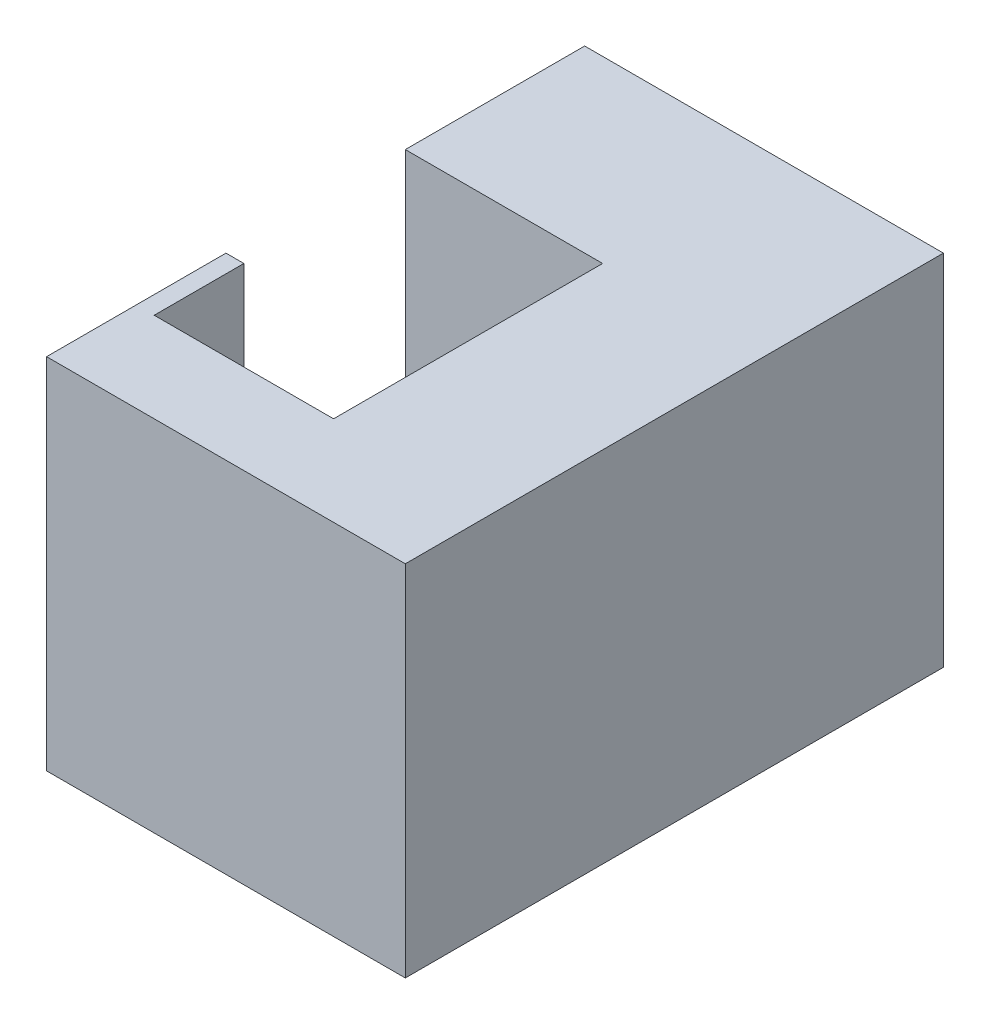
ISO-10303-21;
HEADER;
FILE_DESCRIPTION(('STEP AP214'),'2;1');
FILE_NAME('part.step','',(''),(''),'','','');
FILE_SCHEMA(('AUTOMOTIVE_DESIGN { 1 0 10303 214 1 1 1 1 }'));
ENDSEC;
DATA;
#1=APPLICATION_CONTEXT('core data for automotive mechanical design processes');
#2=APPLICATION_PROTOCOL_DEFINITION('international standard','automotive_design',2000,#1);
#3=PRODUCT_CONTEXT('',#1,'mechanical');
#4=PRODUCT('Part','Part','',(#3));
#5=PRODUCT_RELATED_PRODUCT_CATEGORY('part','',(#4));
#6=PRODUCT_DEFINITION_FORMATION('','',#4);
#7=PRODUCT_DEFINITION_CONTEXT('part definition',#1,'design');
#8=PRODUCT_DEFINITION('design','',#6,#7);
#9=PRODUCT_DEFINITION_SHAPE('','',#8);
#10=(LENGTH_UNIT() NAMED_UNIT(*) SI_UNIT(.MILLI.,.METRE.));
#11=(NAMED_UNIT(*) PLANE_ANGLE_UNIT() SI_UNIT($,.RADIAN.));
#12=(NAMED_UNIT(*) SI_UNIT($,.STERADIAN.) SOLID_ANGLE_UNIT());
#13=UNCERTAINTY_MEASURE_WITH_UNIT(LENGTH_MEASURE(1.E-05),#10,'distance_accuracy_value','');
#14=(GEOMETRIC_REPRESENTATION_CONTEXT(3) GLOBAL_UNCERTAINTY_ASSIGNED_CONTEXT((#13)) GLOBAL_UNIT_ASSIGNED_CONTEXT((#10,
#11,#12)) REPRESENTATION_CONTEXT('',''));
#15=CARTESIAN_POINT('',(0.,0.,0.));
#16=DIRECTION('',(0.,0.,1.));
#17=DIRECTION('',(1.,0.,0.));
#18=AXIS2_PLACEMENT_3D('',#15,#16,#17);
#19=CARTESIAN_POINT('',(-2.5,5.,3.75));
#20=DIRECTION('',(1.,0.,0.));
#21=DIRECTION('',(0.,0.,-1.));
#22=AXIS2_PLACEMENT_3D('',#19,#20,#21);
#23=PLANE('',#22);
#24=DIRECTION('',(0.,1.,0.));
#25=VECTOR('',#24,1.);
#26=CARTESIAN_POINT('',(-2.5,-12.8847050800552,1.25));
#27=LINE('',#26,#25);
#28=CARTESIAN_POINT('',(-2.5,0.,1.25));
#29=VERTEX_POINT('',#28);
#30=CARTESIAN_POINT('',(-2.5,5.,1.25));
#31=VERTEX_POINT('',#30);
#32=EDGE_CURVE('E171',#29,#31,#27,.T.);
#33=ORIENTED_EDGE('',*,*,#32,.F.);
#34=DIRECTION('',(0.,0.,1.));
#35=VECTOR('',#34,1.);
#36=CARTESIAN_POINT('',(-2.5,0.,3.75));
#37=LINE('',#36,#35);
#38=CARTESIAN_POINT('',(-2.5,0.,3.75));
#39=VERTEX_POINT('',#38);
#40=EDGE_CURVE('E200',#29,#39,#37,.T.);
#41=ORIENTED_EDGE('',*,*,#40,.T.);
#42=DIRECTION('',(0.,-1.,0.));
#43=VECTOR('',#42,1.);
#44=CARTESIAN_POINT('',(-2.5,5.,3.75));
#45=LINE('',#44,#43);
#46=CARTESIAN_POINT('',(-2.5,5.,3.75));
#47=VERTEX_POINT('',#46);
#48=EDGE_CURVE('E209',#47,#39,#45,.T.);
#49=ORIENTED_EDGE('',*,*,#48,.F.);
#50=DIRECTION('',(0.,0.,1.));
#51=VECTOR('',#50,1.);
#52=CARTESIAN_POINT('',(-2.5,5.,3.75));
#53=LINE('',#52,#51);
#54=EDGE_CURVE('E187',#31,#47,#53,.T.);
#55=ORIENTED_EDGE('',*,*,#54,.F.);
#56=EDGE_LOOP('',(#33,#41,#49,#55));
#57=FACE_BOUND('',#56,.T.);
#58=ADVANCED_FACE('F39',(#57),#23,.F.);
#59=DIRECTION('',(0.,1.,0.));
#60=VECTOR('',#59,1.);
#61=CARTESIAN_POINT('',(-2.5,-12.8847050800552,-1.25));
#62=LINE('',#61,#60);
#63=CARTESIAN_POINT('',(-2.5,0.,-1.25));
#64=VERTEX_POINT('',#63);
#65=CARTESIAN_POINT('',(-2.5,5.,-1.25));
#66=VERTEX_POINT('',#65);
#67=EDGE_CURVE('E55',#64,#66,#62,.T.);
#68=ORIENTED_EDGE('',*,*,#67,.T.);
#69=CARTESIAN_POINT('',(-2.5,5.,-3.75));
#70=VERTEX_POINT('',#69);
#71=EDGE_CURVE('E147',#70,#66,#53,.T.);
#72=ORIENTED_EDGE('',*,*,#71,.F.);
#73=DIRECTION('',(0.,-1.,0.));
#74=VECTOR('',#73,1.);
#75=CARTESIAN_POINT('',(-2.5,5.,-3.75));
#76=LINE('',#75,#74);
#77=CARTESIAN_POINT('',(-2.5,0.,-3.75));
#78=VERTEX_POINT('',#77);
#79=EDGE_CURVE('E48',#70,#78,#76,.T.);
#80=ORIENTED_EDGE('',*,*,#79,.T.);
#81=EDGE_CURVE('E201',#78,#64,#37,.T.);
#82=ORIENTED_EDGE('',*,*,#81,.T.);
#83=EDGE_LOOP('',(#68,#72,#80,#82));
#84=FACE_BOUND('',#83,.T.);
#85=ADVANCED_FACE('F215',(#84),#23,.F.);
#86=CARTESIAN_POINT('',(0.,0.,0.));
#87=DIRECTION('',(0.,-1.,0.));
#88=DIRECTION('',(0.,0.,-1.));
#89=AXIS2_PLACEMENT_3D('',#86,#87,#88);
#90=PLANE('',#89);
#91=ORIENTED_EDGE('',*,*,#40,.F.);
#92=DIRECTION('',(-1.,0.,0.));
#93=VECTOR('',#92,1.);
#94=CARTESIAN_POINT('',(-2.25,0.,1.25));
#95=LINE('',#94,#93);
#96=CARTESIAN_POINT('',(-2.25,0.,1.25));
#97=VERTEX_POINT('',#96);
#98=EDGE_CURVE('E178',#97,#29,#95,.T.);
#99=ORIENTED_EDGE('',*,*,#98,.F.);
#100=DIRECTION('',(0.,0.,-1.));
#101=VECTOR('',#100,1.);
#102=CARTESIAN_POINT('',(-2.25,0.,2.5));
#103=LINE('',#102,#101);
#104=CARTESIAN_POINT('',(-2.25,0.,2.5));
#105=VERTEX_POINT('',#104);
#106=EDGE_CURVE('E181',#105,#97,#103,.T.);
#107=ORIENTED_EDGE('',*,*,#106,.F.);
#108=DIRECTION('',(-1.,0.,0.));
#109=VECTOR('',#108,1.);
#110=CARTESIAN_POINT('',(0.25,0.,2.5));
#111=LINE('',#110,#109);
#112=CARTESIAN_POINT('',(0.25,0.,2.5));
#113=VERTEX_POINT('',#112);
#114=EDGE_CURVE('E224',#113,#105,#111,.T.);
#115=ORIENTED_EDGE('',*,*,#114,.F.);
#116=DIRECTION('',(0.,0.,1.));
#117=VECTOR('',#116,1.);
#118=CARTESIAN_POINT('',(0.25,0.,-1.25));
#119=LINE('',#118,#117);
#120=CARTESIAN_POINT('',(0.25,0.,-1.25));
#121=VERTEX_POINT('',#120);
#122=EDGE_CURVE('E221',#121,#113,#119,.T.);
#123=ORIENTED_EDGE('',*,*,#122,.F.);
#124=DIRECTION('',(1.,0.,0.));
#125=VECTOR('',#124,1.);
#126=CARTESIAN_POINT('',(-2.5,0.,-1.25));
#127=LINE('',#126,#125);
#128=EDGE_CURVE('E141',#64,#121,#127,.T.);
#129=ORIENTED_EDGE('',*,*,#128,.F.);
#130=ORIENTED_EDGE('',*,*,#81,.F.);
#131=DIRECTION('',(-1.,0.,0.));
#132=VECTOR('',#131,1.);
#133=CARTESIAN_POINT('',(-2.5,0.,-3.75));
#134=LINE('',#133,#132);
#135=CARTESIAN_POINT('',(2.5,0.,-3.75));
#136=VERTEX_POINT('',#135);
#137=EDGE_CURVE('E197',#136,#78,#134,.T.);
#138=ORIENTED_EDGE('',*,*,#137,.F.);
#139=DIRECTION('',(0.,0.,-1.));
#140=VECTOR('',#139,1.);
#141=CARTESIAN_POINT('',(2.5,0.,3.75));
#142=LINE('',#141,#140);
#143=CARTESIAN_POINT('',(2.5,0.,3.75));
#144=VERTEX_POINT('',#143);
#145=EDGE_CURVE('E193',#144,#136,#142,.T.);
#146=ORIENTED_EDGE('',*,*,#145,.F.);
#147=DIRECTION('',(1.,0.,0.));
#148=VECTOR('',#147,1.);
#149=CARTESIAN_POINT('',(-2.5,0.,3.75));
#150=LINE('',#149,#148);
#151=EDGE_CURVE('E85',#39,#144,#150,.T.);
#152=ORIENTED_EDGE('',*,*,#151,.F.);
#153=EDGE_LOOP('',(#91,#99,#107,#115,#123,#129,#130,#138,#146,#152));
#154=FACE_BOUND('',#153,.T.);
#155=ADVANCED_FACE('F218',(#154),#90,.T.);
#156=CARTESIAN_POINT('',(2.5,5.,3.75));
#157=DIRECTION('',(-1.,0.,0.));
#158=DIRECTION('',(0.,0.,1.));
#159=AXIS2_PLACEMENT_3D('',#156,#157,#158);
#160=PLANE('',#159);
#161=ORIENTED_EDGE('',*,*,#145,.T.);
#162=DIRECTION('',(0.,-1.,0.));
#163=VECTOR('',#162,1.);
#164=CARTESIAN_POINT('',(2.5,5.,-3.75));
#165=LINE('',#164,#163);
#166=CARTESIAN_POINT('',(2.5,5.,-3.75));
#167=VERTEX_POINT('',#166);
#168=EDGE_CURVE('E11',#167,#136,#165,.T.);
#169=ORIENTED_EDGE('',*,*,#168,.F.);
#170=DIRECTION('',(0.,0.,-1.));
#171=VECTOR('',#170,1.);
#172=CARTESIAN_POINT('',(2.5,5.,3.75));
#173=LINE('',#172,#171);
#174=CARTESIAN_POINT('',(2.5,5.,3.75));
#175=VERTEX_POINT('',#174);
#176=EDGE_CURVE('E182',#175,#167,#173,.T.);
#177=ORIENTED_EDGE('',*,*,#176,.F.);
#178=DIRECTION('',(0.,-1.,0.));
#179=VECTOR('',#178,1.);
#180=CARTESIAN_POINT('',(2.5,5.,3.75));
#181=LINE('',#180,#179);
#182=EDGE_CURVE('E192',#175,#144,#181,.T.);
#183=ORIENTED_EDGE('',*,*,#182,.T.);
#184=EDGE_LOOP('',(#161,#169,#177,#183));
#185=FACE_BOUND('',#184,.T.);
#186=ADVANCED_FACE('F41',(#185),#160,.F.);
#187=CARTESIAN_POINT('',(-2.5,5.,-3.75));
#188=DIRECTION('',(0.,0.,1.));
#189=DIRECTION('',(1.,0.,0.));
#190=AXIS2_PLACEMENT_3D('',#187,#188,#189);
#191=PLANE('',#190);
#192=ORIENTED_EDGE('',*,*,#137,.T.);
#193=ORIENTED_EDGE('',*,*,#79,.F.);
#194=DIRECTION('',(-1.,0.,0.));
#195=VECTOR('',#194,1.);
#196=CARTESIAN_POINT('',(-2.5,5.,-3.75));
#197=LINE('',#196,#195);
#198=EDGE_CURVE('E92',#167,#70,#197,.T.);
#199=ORIENTED_EDGE('',*,*,#198,.F.);
#200=ORIENTED_EDGE('',*,*,#168,.T.);
#201=EDGE_LOOP('',(#192,#193,#199,#200));
#202=FACE_BOUND('',#201,.T.);
#203=ADVANCED_FACE('F247',(#202),#191,.F.);
#204=CARTESIAN_POINT('',(-2.5,5.,3.75));
#205=DIRECTION('',(0.,0.,-1.));
#206=DIRECTION('',(-1.,0.,0.));
#207=AXIS2_PLACEMENT_3D('',#204,#205,#206);
#208=PLANE('',#207);
#209=ORIENTED_EDGE('',*,*,#151,.T.);
#210=ORIENTED_EDGE('',*,*,#182,.F.);
#211=DIRECTION('',(1.,0.,0.));
#212=VECTOR('',#211,1.);
#213=CARTESIAN_POINT('',(-2.5,5.,3.75));
#214=LINE('',#213,#212);
#215=EDGE_CURVE('E64',#47,#175,#214,.T.);
#216=ORIENTED_EDGE('',*,*,#215,.F.);
#217=ORIENTED_EDGE('',*,*,#48,.T.);
#218=EDGE_LOOP('',(#209,#210,#216,#217));
#219=FACE_BOUND('',#218,.T.);
#220=ADVANCED_FACE('F243',(#219),#208,.F.);
#221=CARTESIAN_POINT('',(0.,5.,0.));
#222=DIRECTION('',(0.,-1.,0.));
#223=DIRECTION('',(0.,0.,-1.));
#224=AXIS2_PLACEMENT_3D('',#221,#222,#223);
#225=PLANE('',#224);
#226=ORIENTED_EDGE('',*,*,#71,.T.);
#227=DIRECTION('',(1.,0.,0.));
#228=VECTOR('',#227,1.);
#229=CARTESIAN_POINT('',(-2.5,5.,-1.25));
#230=LINE('',#229,#228);
#231=CARTESIAN_POINT('',(0.25,5.,-1.25));
#232=VERTEX_POINT('',#231);
#233=EDGE_CURVE('E138',#66,#232,#230,.T.);
#234=ORIENTED_EDGE('',*,*,#233,.T.);
#235=DIRECTION('',(0.,0.,1.));
#236=VECTOR('',#235,1.);
#237=CARTESIAN_POINT('',(0.25,5.,-1.25));
#238=LINE('',#237,#236);
#239=CARTESIAN_POINT('',(0.25,5.,2.5));
#240=VERTEX_POINT('',#239);
#241=EDGE_CURVE('E127',#232,#240,#238,.T.);
#242=ORIENTED_EDGE('',*,*,#241,.T.);
#243=DIRECTION('',(-1.,0.,0.));
#244=VECTOR('',#243,1.);
#245=CARTESIAN_POINT('',(0.25,5.,2.5));
#246=LINE('',#245,#244);
#247=CARTESIAN_POINT('',(-2.25,5.,2.5));
#248=VERTEX_POINT('',#247);
#249=EDGE_CURVE('E137',#240,#248,#246,.T.);
#250=ORIENTED_EDGE('',*,*,#249,.T.);
#251=DIRECTION('',(0.,0.,-1.));
#252=VECTOR('',#251,1.);
#253=CARTESIAN_POINT('',(-2.25,5.,2.5));
#254=LINE('',#253,#252);
#255=CARTESIAN_POINT('',(-2.25,5.,1.25));
#256=VERTEX_POINT('',#255);
#257=EDGE_CURVE('E155',#248,#256,#254,.T.);
#258=ORIENTED_EDGE('',*,*,#257,.T.);
#259=DIRECTION('',(-1.,0.,0.));
#260=VECTOR('',#259,1.);
#261=CARTESIAN_POINT('',(-2.25,5.,1.25));
#262=LINE('',#261,#260);
#263=EDGE_CURVE('E159',#256,#31,#262,.T.);
#264=ORIENTED_EDGE('',*,*,#263,.T.);
#265=ORIENTED_EDGE('',*,*,#54,.T.);
#266=ORIENTED_EDGE('',*,*,#215,.T.);
#267=ORIENTED_EDGE('',*,*,#176,.T.);
#268=ORIENTED_EDGE('',*,*,#198,.T.);
#269=EDGE_LOOP('',(#226,#234,#242,#250,#258,#264,#265,#266,#267,#268));
#270=FACE_BOUND('',#269,.T.);
#271=ADVANCED_FACE('F145',(#270),#225,.F.);
#272=CARTESIAN_POINT('',(-2.25,-12.8847050800552,1.25));
#273=DIRECTION('',(0.,0.,-1.));
#274=DIRECTION('',(-1.,0.,0.));
#275=AXIS2_PLACEMENT_3D('',#272,#273,#274);
#276=PLANE('',#275);
#277=DIRECTION('',(0.,1.,0.));
#278=VECTOR('',#277,1.);
#279=CARTESIAN_POINT('',(-2.25,-12.8847050800552,1.25));
#280=LINE('',#279,#278);
#281=EDGE_CURVE('E174',#97,#256,#280,.T.);
#282=ORIENTED_EDGE('',*,*,#281,.F.);
#283=ORIENTED_EDGE('',*,*,#98,.T.);
#284=ORIENTED_EDGE('',*,*,#32,.T.);
#285=ORIENTED_EDGE('',*,*,#263,.F.);
#286=EDGE_LOOP('',(#282,#283,#284,#285));
#287=FACE_BOUND('',#286,.T.);
#288=ADVANCED_FACE('F236',(#287),#276,.T.);
#289=CARTESIAN_POINT('',(-2.25,-12.8847050800552,2.5));
#290=DIRECTION('',(1.,0.,0.));
#291=DIRECTION('',(0.,0.,-1.));
#292=AXIS2_PLACEMENT_3D('',#289,#290,#291);
#293=PLANE('',#292);
#294=DIRECTION('',(0.,1.,0.));
#295=VECTOR('',#294,1.);
#296=CARTESIAN_POINT('',(-2.25,-12.8847050800552,2.5));
#297=LINE('',#296,#295);
#298=EDGE_CURVE('E167',#105,#248,#297,.T.);
#299=ORIENTED_EDGE('',*,*,#298,.F.);
#300=ORIENTED_EDGE('',*,*,#106,.T.);
#301=ORIENTED_EDGE('',*,*,#281,.T.);
#302=ORIENTED_EDGE('',*,*,#257,.F.);
#303=EDGE_LOOP('',(#299,#300,#301,#302));
#304=FACE_BOUND('',#303,.T.);
#305=ADVANCED_FACE('F233',(#304),#293,.T.);
#306=CARTESIAN_POINT('',(0.25,-12.8847050800552,2.5));
#307=DIRECTION('',(0.,0.,-1.));
#308=DIRECTION('',(-1.,0.,0.));
#309=AXIS2_PLACEMENT_3D('',#306,#307,#308);
#310=PLANE('',#309);
#311=DIRECTION('',(0.,1.,0.));
#312=VECTOR('',#311,1.);
#313=CARTESIAN_POINT('',(0.25,-12.8847050800552,2.5));
#314=LINE('',#313,#312);
#315=EDGE_CURVE('E133',#113,#240,#314,.T.);
#316=ORIENTED_EDGE('',*,*,#315,.F.);
#317=ORIENTED_EDGE('',*,*,#114,.T.);
#318=ORIENTED_EDGE('',*,*,#298,.T.);
#319=ORIENTED_EDGE('',*,*,#249,.F.);
#320=EDGE_LOOP('',(#316,#317,#318,#319));
#321=FACE_BOUND('',#320,.T.);
#322=ADVANCED_FACE('F268',(#321),#310,.T.);
#323=CARTESIAN_POINT('',(0.25,-12.8847050800552,-1.25));
#324=DIRECTION('',(-1.,0.,0.));
#325=DIRECTION('',(0.,0.,1.));
#326=AXIS2_PLACEMENT_3D('',#323,#324,#325);
#327=PLANE('',#326);
#328=DIRECTION('',(0.,1.,0.));
#329=VECTOR('',#328,1.);
#330=CARTESIAN_POINT('',(0.25,-12.8847050800552,-1.25));
#331=LINE('',#330,#329);
#332=EDGE_CURVE('E130',#121,#232,#331,.T.);
#333=ORIENTED_EDGE('',*,*,#332,.F.);
#334=ORIENTED_EDGE('',*,*,#122,.T.);
#335=ORIENTED_EDGE('',*,*,#315,.T.);
#336=ORIENTED_EDGE('',*,*,#241,.F.);
#337=EDGE_LOOP('',(#333,#334,#335,#336));
#338=FACE_BOUND('',#337,.T.);
#339=ADVANCED_FACE('F129',(#338),#327,.T.);
#340=CARTESIAN_POINT('',(-2.5,-12.8847050800552,-1.25));
#341=DIRECTION('',(0.,0.,1.));
#342=DIRECTION('',(1.,0.,0.));
#343=AXIS2_PLACEMENT_3D('',#340,#341,#342);
#344=PLANE('',#343);
#345=ORIENTED_EDGE('',*,*,#67,.F.);
#346=ORIENTED_EDGE('',*,*,#128,.T.);
#347=ORIENTED_EDGE('',*,*,#332,.T.);
#348=ORIENTED_EDGE('',*,*,#233,.F.);
#349=EDGE_LOOP('',(#345,#346,#347,#348));
#350=FACE_BOUND('',#349,.T.);
#351=ADVANCED_FACE('F140',(#350),#344,.T.);
#352=CLOSED_SHELL('',(#58,#85,#155,#186,#203,#220,#271,#288,#305,#322,#339,#351));
#353=MANIFOLD_SOLID_BREP('B2',#352);
#354=ADVANCED_BREP_SHAPE_REPRESENTATION('',(#18,#353),#14);
#355=SHAPE_DEFINITION_REPRESENTATION(#9,#354);
ENDSEC;
END-ISO-10303-21;
